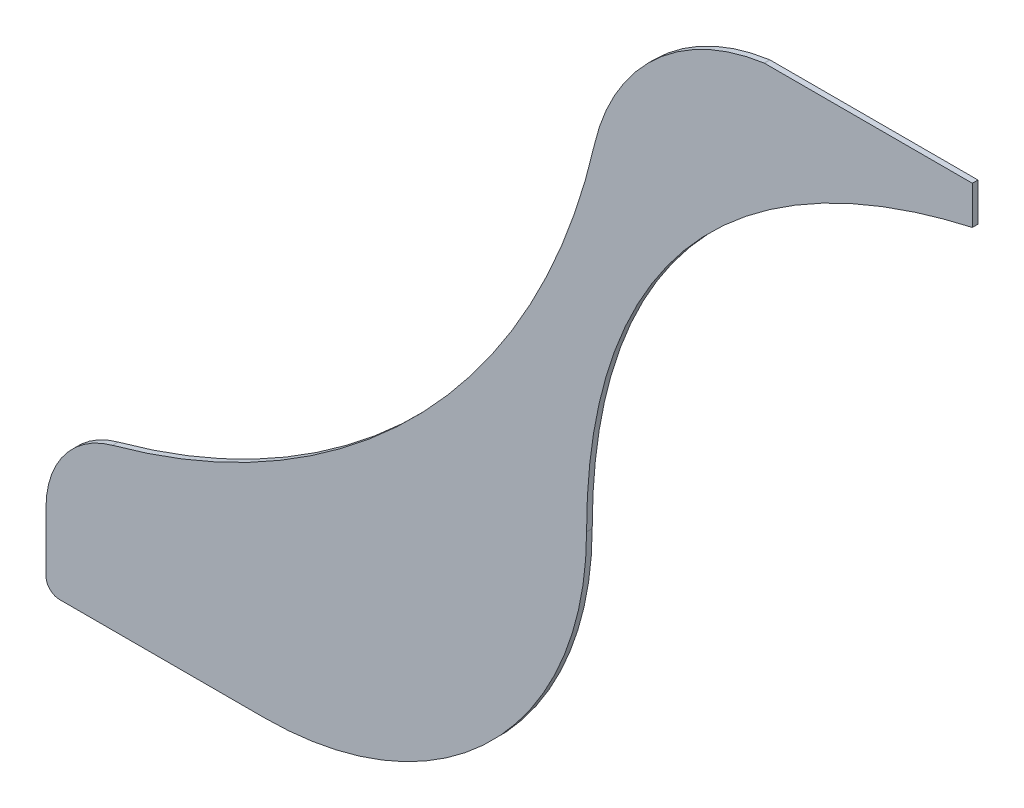
ISO-10303-21;
HEADER;
FILE_DESCRIPTION(('STEP AP214'),'2;1');
FILE_NAME('part.step','',(''),(''),'','','');
FILE_SCHEMA(('AUTOMOTIVE_DESIGN { 1 0 10303 214 1 1 1 1 }'));
ENDSEC;
DATA;
#1=APPLICATION_CONTEXT('core data for automotive mechanical design processes');
#2=APPLICATION_PROTOCOL_DEFINITION('international standard','automotive_design',2000,#1);
#3=PRODUCT_CONTEXT('',#1,'mechanical');
#4=PRODUCT('Part','Part','',(#3));
#5=PRODUCT_RELATED_PRODUCT_CATEGORY('part','',(#4));
#6=PRODUCT_DEFINITION_FORMATION('','',#4);
#7=PRODUCT_DEFINITION_CONTEXT('part definition',#1,'design');
#8=PRODUCT_DEFINITION('design','',#6,#7);
#9=PRODUCT_DEFINITION_SHAPE('','',#8);
#10=(LENGTH_UNIT() NAMED_UNIT(*) SI_UNIT(.MILLI.,.METRE.));
#11=(NAMED_UNIT(*) PLANE_ANGLE_UNIT() SI_UNIT($,.RADIAN.));
#12=(NAMED_UNIT(*) SI_UNIT($,.STERADIAN.) SOLID_ANGLE_UNIT());
#13=UNCERTAINTY_MEASURE_WITH_UNIT(LENGTH_MEASURE(1.E-05),#10,'distance_accuracy_value','');
#14=(GEOMETRIC_REPRESENTATION_CONTEXT(3) GLOBAL_UNCERTAINTY_ASSIGNED_CONTEXT((#13)) GLOBAL_UNIT_ASSIGNED_CONTEXT((#10,
#11,#12)) REPRESENTATION_CONTEXT('',''));
#15=CARTESIAN_POINT('',(0.,0.,0.));
#16=DIRECTION('',(0.,0.,1.));
#17=DIRECTION('',(1.,0.,0.));
#18=AXIS2_PLACEMENT_3D('',#15,#16,#17);
#19=CARTESIAN_POINT('',(372.702998231102,-92.9114705028054,3.175));
#20=DIRECTION('',(0.,0.,-1.));
#21=DIRECTION('',(-1.,0.,0.));
#22=AXIS2_PLACEMENT_3D('',#19,#20,#21);
#23=CYLINDRICAL_SURFACE('',#22,181.668641430372);
#24=CARTESIAN_POINT('',(372.702998231102,-92.9114705028054,0.));
#25=DIRECTION('',(0.,0.,1.));
#26=DIRECTION('',(1.,0.,0.));
#27=AXIS2_PLACEMENT_3D('',#24,#25,#26);
#28=CIRCLE('',#27,181.668641430372);
#29=CARTESIAN_POINT('',(554.371639661473,-92.9114705028054,0.));
#30=VERTEX_POINT('',#29);
#31=CARTESIAN_POINT('',(372.702998231102,-274.580111933177,0.));
#32=VERTEX_POINT('',#31);
#33=EDGE_CURVE('E140',#30,#32,#28,.F.);
#34=ORIENTED_EDGE('',*,*,#33,.F.);
#35=DIRECTION('',(0.,0.,-1.));
#36=VECTOR('',#35,1.);
#37=CARTESIAN_POINT('',(554.371639661473,-92.9114705028054,3.175));
#38=LINE('',#37,#36);
#39=CARTESIAN_POINT('',(554.371639661473,-92.9114705028054,3.175));
#40=VERTEX_POINT('',#39);
#41=EDGE_CURVE('E11',#40,#30,#38,.T.);
#42=ORIENTED_EDGE('',*,*,#41,.F.);
#43=CARTESIAN_POINT('',(372.702998231102,-92.9114705028054,3.175));
#44=DIRECTION('',(0.,0.,1.));
#45=DIRECTION('',(1.,0.,0.));
#46=AXIS2_PLACEMENT_3D('',#43,#44,#45);
#47=CIRCLE('',#46,181.668641430372);
#48=CARTESIAN_POINT('',(372.702998231102,-274.580111933177,3.175));
#49=VERTEX_POINT('',#48);
#50=EDGE_CURVE('E166',#40,#49,#47,.F.);
#51=ORIENTED_EDGE('',*,*,#50,.T.);
#52=DIRECTION('',(0.,0.,-1.));
#53=VECTOR('',#52,1.);
#54=CARTESIAN_POINT('',(372.702998231102,-274.580111933177,3.175));
#55=LINE('',#54,#53);
#56=EDGE_CURVE('E91',#49,#32,#55,.T.);
#57=ORIENTED_EDGE('',*,*,#56,.T.);
#58=EDGE_LOOP('',(#34,#42,#51,#57));
#59=FACE_BOUND('',#58,.T.);
#60=ADVANCED_FACE('F34',(#59),#23,.T.);
#61=CARTESIAN_POINT('',(554.371639661473,-92.9114705028053,3.175));
#62=CARTESIAN_POINT('',(554.371639661473,52.307938415725,3.175));
#63=CARTESIAN_POINT('',(646.172603674188,136.193906474132,3.175));
#64=CARTESIAN_POINT('',(771.903793001005,164.46580566783,3.175));
#65=B_SPLINE_CURVE_WITH_KNOTS('',3,(#61,#62,#63,#64),.UNSPECIFIED.,.F.,.F.,(4,4),(0.,1.),.UNSPECIFIED.);
#66=DIRECTION('',(0.,0.,-1.));
#67=VECTOR('',#66,1.);
#68=SURFACE_OF_LINEAR_EXTRUSION('',#65,#67);
#69=CARTESIAN_POINT('',(554.371639661473,-92.9114705028053,0.));
#70=CARTESIAN_POINT('',(554.371639661473,52.307938415725,0.));
#71=CARTESIAN_POINT('',(646.172603674188,136.193906474132,0.));
#72=CARTESIAN_POINT('',(771.903793001005,164.46580566783,0.));
#73=B_SPLINE_CURVE_WITH_KNOTS('',3,(#69,#70,#71,#72),.UNSPECIFIED.,.F.,.F.,(4,4),(0.,1.),.UNSPECIFIED.);
#74=CARTESIAN_POINT('',(771.903793001005,164.46580566783,0.));
#75=VERTEX_POINT('',#74);
#76=EDGE_CURVE('E143',#30,#75,#73,.T.);
#77=ORIENTED_EDGE('',*,*,#76,.T.);
#78=DIRECTION('',(0.,0.,-1.));
#79=VECTOR('',#78,1.);
#80=CARTESIAN_POINT('',(771.903793001005,164.46580566783,3.175));
#81=LINE('',#80,#79);
#82=CARTESIAN_POINT('',(771.903793001005,164.46580566783,3.175));
#83=VERTEX_POINT('',#82);
#84=EDGE_CURVE('E42',#83,#75,#81,.T.);
#85=ORIENTED_EDGE('',*,*,#84,.F.);
#86=EDGE_CURVE('E210',#40,#83,#65,.T.);
#87=ORIENTED_EDGE('',*,*,#86,.F.);
#88=ORIENTED_EDGE('',*,*,#41,.T.);
#89=EDGE_LOOP('',(#77,#85,#87,#88));
#90=FACE_BOUND('',#89,.T.);
#91=ADVANCED_FACE('F218',(#90),#68,.F.);
#92=CARTESIAN_POINT('',(771.903793001005,0.,3.175));
#93=DIRECTION('',(-1.,0.,0.));
#94=DIRECTION('',(0.,0.,1.));
#95=AXIS2_PLACEMENT_3D('',#92,#93,#94);
#96=PLANE('',#95);
#97=DIRECTION('',(0.,1.,0.));
#98=VECTOR('',#97,1.);
#99=CARTESIAN_POINT('',(771.903793001005,0.,0.));
#100=LINE('',#99,#98);
#101=CARTESIAN_POINT('',(771.903793001005,186.055805664496,0.));
#102=VERTEX_POINT('',#101);
#103=EDGE_CURVE('E147',#75,#102,#100,.T.);
#104=ORIENTED_EDGE('',*,*,#103,.T.);
#105=DIRECTION('',(0.,0.,-1.));
#106=VECTOR('',#105,1.);
#107=CARTESIAN_POINT('',(771.903793001005,186.055805664496,3.175));
#108=LINE('',#107,#106);
#109=CARTESIAN_POINT('',(771.903793001005,186.055805664496,3.175));
#110=VERTEX_POINT('',#109);
#111=EDGE_CURVE('E177',#110,#102,#108,.T.);
#112=ORIENTED_EDGE('',*,*,#111,.F.);
#113=DIRECTION('',(0.,1.,0.));
#114=VECTOR('',#113,1.);
#115=CARTESIAN_POINT('',(771.903793001005,0.,3.175));
#116=LINE('',#115,#114);
#117=EDGE_CURVE('E186',#83,#110,#116,.T.);
#118=ORIENTED_EDGE('',*,*,#117,.F.);
#119=ORIENTED_EDGE('',*,*,#84,.T.);
#120=EDGE_LOOP('',(#104,#112,#118,#119));
#121=FACE_BOUND('',#120,.T.);
#122=ADVANCED_FACE('F184',(#121),#96,.F.);
#123=CARTESIAN_POINT('',(0.,186.055805664495,3.175));
#124=DIRECTION('',(0.,-1.,0.));
#125=DIRECTION('',(1.,0.,0.));
#126=AXIS2_PLACEMENT_3D('',#123,#124,#125);
#127=PLANE('',#126);
#128=DIRECTION('',(-1.,0.,0.));
#129=VECTOR('',#128,1.);
#130=CARTESIAN_POINT('',(0.,186.055805664495,0.));
#131=LINE('',#130,#129);
#132=CARTESIAN_POINT('',(654.555793001005,186.055805664496,0.));
#133=VERTEX_POINT('',#132);
#134=EDGE_CURVE('E152',#102,#133,#131,.T.);
#135=ORIENTED_EDGE('',*,*,#134,.T.);
#136=DIRECTION('',(0.,0.,-1.));
#137=VECTOR('',#136,1.);
#138=CARTESIAN_POINT('',(654.555793001005,186.055805664496,3.175));
#139=LINE('',#138,#137);
#140=CARTESIAN_POINT('',(654.555793001005,186.055805664496,3.175));
#141=VERTEX_POINT('',#140);
#142=EDGE_CURVE('E174',#141,#133,#139,.T.);
#143=ORIENTED_EDGE('',*,*,#142,.F.);
#144=DIRECTION('',(-1.,0.,0.));
#145=VECTOR('',#144,1.);
#146=CARTESIAN_POINT('',(0.,186.055805664495,3.175));
#147=LINE('',#146,#145);
#148=EDGE_CURVE('E204',#110,#141,#147,.T.);
#149=ORIENTED_EDGE('',*,*,#148,.F.);
#150=ORIENTED_EDGE('',*,*,#111,.T.);
#151=EDGE_LOOP('',(#135,#143,#149,#150));
#152=FACE_BOUND('',#151,.T.);
#153=ADVANCED_FACE('F195',(#152),#127,.F.);
#154=CARTESIAN_POINT('',(670.214973710909,72.8335461061619,3.175));
#155=DIRECTION('',(0.,0.,-1.));
#156=DIRECTION('',(-1.,0.,0.));
#157=AXIS2_PLACEMENT_3D('',#154,#155,#156);
#158=CYLINDRICAL_SURFACE('',#157,114.3);
#159=CARTESIAN_POINT('',(670.214973710909,72.8335461061619,0.));
#160=DIRECTION('',(0.,0.,1.));
#161=DIRECTION('',(1.,0.,0.));
#162=AXIS2_PLACEMENT_3D('',#159,#160,#161);
#163=CIRCLE('',#162,114.3);
#164=CARTESIAN_POINT('',(558.8,98.352042006147,0.));
#165=VERTEX_POINT('',#164);
#166=EDGE_CURVE('E154',#133,#165,#163,.T.);
#167=ORIENTED_EDGE('',*,*,#166,.T.);
#168=DIRECTION('',(0.,0.,-1.));
#169=VECTOR('',#168,1.);
#170=CARTESIAN_POINT('',(558.8,98.352042006147,3.175));
#171=LINE('',#170,#169);
#172=CARTESIAN_POINT('',(558.8,98.352042006147,3.175));
#173=VERTEX_POINT('',#172);
#174=EDGE_CURVE('E172',#173,#165,#171,.T.);
#175=ORIENTED_EDGE('',*,*,#174,.F.);
#176=CARTESIAN_POINT('',(670.214973710909,72.8335461061619,3.175));
#177=DIRECTION('',(0.,0.,1.));
#178=DIRECTION('',(1.,0.,0.));
#179=AXIS2_PLACEMENT_3D('',#176,#177,#178);
#180=CIRCLE('',#179,114.3);
#181=EDGE_CURVE('E201',#141,#173,#180,.T.);
#182=ORIENTED_EDGE('',*,*,#181,.F.);
#183=ORIENTED_EDGE('',*,*,#142,.T.);
#184=EDGE_LOOP('',(#167,#175,#182,#183));
#185=FACE_BOUND('',#184,.T.);
#186=ADVANCED_FACE('F199',(#185),#158,.T.);
#187=CARTESIAN_POINT('',(187.416754296971,183.413695006097,3.175));
#188=DIRECTION('',(0.,0.,-1.));
#189=DIRECTION('',(-1.,0.,0.));
#190=AXIS2_PLACEMENT_3D('',#187,#188,#189);
#191=CYLINDRICAL_SURFACE('',#190,381.);
#192=CARTESIAN_POINT('',(187.416754296971,183.413695006097,0.));
#193=DIRECTION('',(0.,0.,1.));
#194=DIRECTION('',(1.,0.,0.));
#195=AXIS2_PLACEMENT_3D('',#192,#193,#194);
#196=CIRCLE('',#195,381.);
#197=CARTESIAN_POINT('',(287.082829618591,-184.319460189332,0.));
#198=VERTEX_POINT('',#197);
#199=EDGE_CURVE('E157',#198,#165,#196,.T.);
#200=ORIENTED_EDGE('',*,*,#199,.F.);
#201=DIRECTION('',(0.,0.,-1.));
#202=VECTOR('',#201,1.);
#203=CARTESIAN_POINT('',(287.082829618591,-184.319460189332,3.175));
#204=LINE('',#203,#202);
#205=CARTESIAN_POINT('',(287.082829618591,-184.319460189332,3.175));
#206=VERTEX_POINT('',#205);
#207=EDGE_CURVE('E170',#206,#198,#204,.T.);
#208=ORIENTED_EDGE('',*,*,#207,.F.);
#209=CARTESIAN_POINT('',(187.416754296971,183.413695006097,3.175));
#210=DIRECTION('',(0.,0.,1.));
#211=DIRECTION('',(1.,0.,0.));
#212=AXIS2_PLACEMENT_3D('',#209,#210,#211);
#213=CIRCLE('',#212,381.);
#214=EDGE_CURVE('E203',#206,#173,#213,.T.);
#215=ORIENTED_EDGE('',*,*,#214,.T.);
#216=ORIENTED_EDGE('',*,*,#174,.T.);
#217=EDGE_LOOP('',(#200,#208,#215,#216));
#218=FACE_BOUND('',#217,.T.);
#219=ADVANCED_FACE('F227',(#218),#191,.F.);
#220=CARTESIAN_POINT('',(300.371639661473,-233.350547548723,3.175));
#221=DIRECTION('',(0.,0.,-1.));
#222=DIRECTION('',(-1.,0.,0.));
#223=AXIS2_PLACEMENT_3D('',#220,#221,#222);
#224=CYLINDRICAL_SURFACE('',#223,50.8000000000001);
#225=CARTESIAN_POINT('',(300.371639661473,-233.350547548723,0.));
#226=DIRECTION('',(0.,0.,1.));
#227=DIRECTION('',(1.,0.,0.));
#228=AXIS2_PLACEMENT_3D('',#225,#226,#227);
#229=CIRCLE('',#228,50.8000000000001);
#230=CARTESIAN_POINT('',(249.571639661473,-233.350547548723,0.));
#231=VERTEX_POINT('',#230);
#232=EDGE_CURVE('E160',#198,#231,#229,.T.);
#233=ORIENTED_EDGE('',*,*,#232,.T.);
#234=DIRECTION('',(0.,0.,-1.));
#235=VECTOR('',#234,1.);
#236=CARTESIAN_POINT('',(249.571639661473,-233.350547548723,3.175));
#237=LINE('',#236,#235);
#238=CARTESIAN_POINT('',(249.571639661473,-233.350547548723,3.175));
#239=VERTEX_POINT('',#238);
#240=EDGE_CURVE('E132',#239,#231,#237,.T.);
#241=ORIENTED_EDGE('',*,*,#240,.F.);
#242=CARTESIAN_POINT('',(300.371639661473,-233.350547548723,3.175));
#243=DIRECTION('',(0.,0.,1.));
#244=DIRECTION('',(1.,0.,0.));
#245=AXIS2_PLACEMENT_3D('',#242,#243,#244);
#246=CIRCLE('',#245,50.8000000000001);
#247=EDGE_CURVE('E123',#206,#239,#246,.T.);
#248=ORIENTED_EDGE('',*,*,#247,.F.);
#249=ORIENTED_EDGE('',*,*,#207,.T.);
#250=EDGE_LOOP('',(#233,#241,#248,#249));
#251=FACE_BOUND('',#250,.T.);
#252=ADVANCED_FACE('F230',(#251),#224,.T.);
#253=CARTESIAN_POINT('',(249.571639661473,-4.12204361645611E-13,3.175));
#254=DIRECTION('',(1.,0.,0.));
#255=DIRECTION('',(0.,1.,0.));
#256=AXIS2_PLACEMENT_3D('',#253,#254,#255);
#257=PLANE('',#256);
#258=DIRECTION('',(0.,-1.,0.));
#259=VECTOR('',#258,1.);
#260=CARTESIAN_POINT('',(249.571639661473,-4.12204361645611E-13,0.));
#261=LINE('',#260,#259);
#262=CARTESIAN_POINT('',(249.571639661473,-266.960111933177,0.));
#263=VERTEX_POINT('',#262);
#264=EDGE_CURVE('E131',#231,#263,#261,.T.);
#265=ORIENTED_EDGE('',*,*,#264,.T.);
#266=DIRECTION('',(0.,0.,-1.));
#267=VECTOR('',#266,1.);
#268=CARTESIAN_POINT('',(249.571639661473,-266.960111933177,3.175));
#269=LINE('',#268,#267);
#270=CARTESIAN_POINT('',(249.571639661473,-266.960111933177,3.175));
#271=VERTEX_POINT('',#270);
#272=EDGE_CURVE('E128',#271,#263,#269,.T.);
#273=ORIENTED_EDGE('',*,*,#272,.F.);
#274=DIRECTION('',(0.,-1.,0.));
#275=VECTOR('',#274,1.);
#276=CARTESIAN_POINT('',(249.571639661473,-4.12204361645611E-13,3.175));
#277=LINE('',#276,#275);
#278=EDGE_CURVE('E116',#239,#271,#277,.T.);
#279=ORIENTED_EDGE('',*,*,#278,.F.);
#280=ORIENTED_EDGE('',*,*,#240,.T.);
#281=EDGE_LOOP('',(#265,#273,#279,#280));
#282=FACE_BOUND('',#281,.T.);
#283=ADVANCED_FACE('F129',(#282),#257,.F.);
#284=CARTESIAN_POINT('',(257.191639661473,-266.960111933177,3.175));
#285=DIRECTION('',(0.,0.,-1.));
#286=DIRECTION('',(-1.,0.,0.));
#287=AXIS2_PLACEMENT_3D('',#284,#285,#286);
#288=CYLINDRICAL_SURFACE('',#287,7.61999999999988);
#289=CARTESIAN_POINT('',(257.191639661473,-266.960111933177,0.));
#290=DIRECTION('',(0.,0.,1.));
#291=DIRECTION('',(1.,0.,0.));
#292=AXIS2_PLACEMENT_3D('',#289,#290,#291);
#293=CIRCLE('',#292,7.61999999999988);
#294=CARTESIAN_POINT('',(257.191639661473,-274.580111933177,0.));
#295=VERTEX_POINT('',#294);
#296=EDGE_CURVE('E84',#263,#295,#293,.T.);
#297=ORIENTED_EDGE('',*,*,#296,.T.);
#298=DIRECTION('',(0.,0.,-1.));
#299=VECTOR('',#298,1.);
#300=CARTESIAN_POINT('',(257.191639661473,-274.580111933177,3.175));
#301=LINE('',#300,#299);
#302=CARTESIAN_POINT('',(257.191639661473,-274.580111933177,3.175));
#303=VERTEX_POINT('',#302);
#304=EDGE_CURVE('E133',#303,#295,#301,.T.);
#305=ORIENTED_EDGE('',*,*,#304,.F.);
#306=CARTESIAN_POINT('',(257.191639661473,-266.960111933177,3.175));
#307=DIRECTION('',(0.,0.,1.));
#308=DIRECTION('',(1.,0.,0.));
#309=AXIS2_PLACEMENT_3D('',#306,#307,#308);
#310=CIRCLE('',#309,7.61999999999988);
#311=EDGE_CURVE('E120',#271,#303,#310,.T.);
#312=ORIENTED_EDGE('',*,*,#311,.F.);
#313=ORIENTED_EDGE('',*,*,#272,.T.);
#314=EDGE_LOOP('',(#297,#305,#312,#313));
#315=FACE_BOUND('',#314,.T.);
#316=ADVANCED_FACE('F135',(#315),#288,.T.);
#317=CARTESIAN_POINT('',(0.,-274.580111933177,3.175));
#318=DIRECTION('',(0.,1.,0.));
#319=DIRECTION('',(0.,0.,1.));
#320=AXIS2_PLACEMENT_3D('',#317,#318,#319);
#321=PLANE('',#320);
#322=DIRECTION('',(1.,0.,0.));
#323=VECTOR('',#322,1.);
#324=CARTESIAN_POINT('',(0.,-274.580111933177,0.));
#325=LINE('',#324,#323);
#326=EDGE_CURVE('E164',#295,#32,#325,.T.);
#327=ORIENTED_EDGE('',*,*,#326,.T.);
#328=ORIENTED_EDGE('',*,*,#56,.F.);
#329=DIRECTION('',(1.,0.,0.));
#330=VECTOR('',#329,1.);
#331=CARTESIAN_POINT('',(0.,-274.580111933177,3.175));
#332=LINE('',#331,#330);
#333=EDGE_CURVE('E50',#303,#49,#332,.T.);
#334=ORIENTED_EDGE('',*,*,#333,.F.);
#335=ORIENTED_EDGE('',*,*,#304,.T.);
#336=EDGE_LOOP('',(#327,#328,#334,#335));
#337=FACE_BOUND('',#336,.T.);
#338=ADVANCED_FACE('F239',(#337),#321,.F.);
#339=CARTESIAN_POINT('',(0.,0.,3.175));
#340=DIRECTION('',(0.,0.,1.));
#341=DIRECTION('',(1.,0.,0.));
#342=AXIS2_PLACEMENT_3D('',#339,#340,#341);
#343=PLANE('',#342);
#344=ORIENTED_EDGE('',*,*,#50,.F.);
#345=ORIENTED_EDGE('',*,*,#86,.T.);
#346=ORIENTED_EDGE('',*,*,#117,.T.);
#347=ORIENTED_EDGE('',*,*,#148,.T.);
#348=ORIENTED_EDGE('',*,*,#181,.T.);
#349=ORIENTED_EDGE('',*,*,#214,.F.);
#350=ORIENTED_EDGE('',*,*,#247,.T.);
#351=ORIENTED_EDGE('',*,*,#278,.T.);
#352=ORIENTED_EDGE('',*,*,#311,.T.);
#353=ORIENTED_EDGE('',*,*,#333,.T.);
#354=EDGE_LOOP('',(#344,#345,#346,#347,#348,#349,#350,#351,#352,#353));
#355=FACE_BOUND('',#354,.T.);
#356=ADVANCED_FACE('F118',(#355),#343,.T.);
#357=CARTESIAN_POINT('',(0.,0.,0.));
#358=DIRECTION('',(0.,0.,1.));
#359=DIRECTION('',(1.,0.,0.));
#360=AXIS2_PLACEMENT_3D('',#357,#358,#359);
#361=PLANE('',#360);
#362=ORIENTED_EDGE('',*,*,#33,.T.);
#363=ORIENTED_EDGE('',*,*,#326,.F.);
#364=ORIENTED_EDGE('',*,*,#296,.F.);
#365=ORIENTED_EDGE('',*,*,#264,.F.);
#366=ORIENTED_EDGE('',*,*,#232,.F.);
#367=ORIENTED_EDGE('',*,*,#199,.T.);
#368=ORIENTED_EDGE('',*,*,#166,.F.);
#369=ORIENTED_EDGE('',*,*,#134,.F.);
#370=ORIENTED_EDGE('',*,*,#103,.F.);
#371=ORIENTED_EDGE('',*,*,#76,.F.);
#372=EDGE_LOOP('',(#362,#363,#364,#365,#366,#367,#368,#369,#370,#371));
#373=FACE_BOUND('',#372,.T.);
#374=ADVANCED_FACE('F191',(#373),#361,.F.);
#375=CLOSED_SHELL('',(#60,#91,#122,#153,#186,#219,#252,#283,#316,#338,#356,#374));
#376=MANIFOLD_SOLID_BREP('B2',#375);
#377=ADVANCED_BREP_SHAPE_REPRESENTATION('',(#18,#376),#14);
#378=SHAPE_DEFINITION_REPRESENTATION(#9,#377);
ENDSEC;
END-ISO-10303-21;
